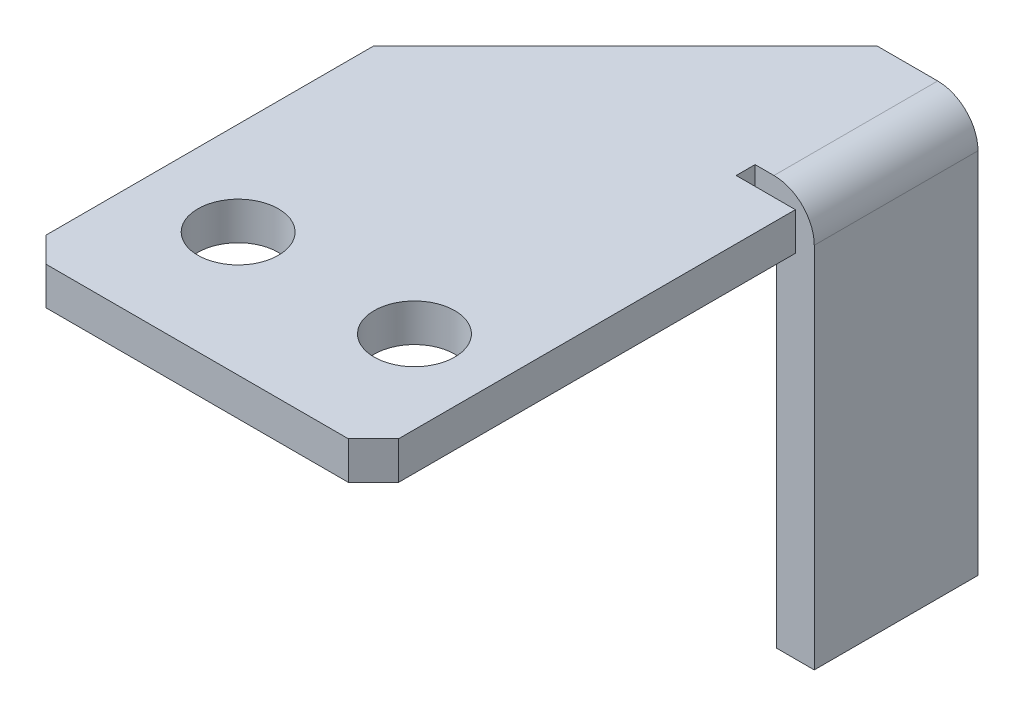
ISO-10303-21;
HEADER;
FILE_DESCRIPTION(('STEP AP214'),'2;1');
FILE_NAME('part.step','',(''),(''),'','','');
FILE_SCHEMA(('AUTOMOTIVE_DESIGN { 1 0 10303 214 1 1 1 1 }'));
ENDSEC;
DATA;
#1=APPLICATION_CONTEXT('core data for automotive mechanical design processes');
#2=APPLICATION_PROTOCOL_DEFINITION('international standard','automotive_design',2000,#1);
#3=PRODUCT_CONTEXT('',#1,'mechanical');
#4=PRODUCT('Part','Part','',(#3));
#5=PRODUCT_RELATED_PRODUCT_CATEGORY('part','',(#4));
#6=PRODUCT_DEFINITION_FORMATION('','',#4);
#7=PRODUCT_DEFINITION_CONTEXT('part definition',#1,'design');
#8=PRODUCT_DEFINITION('design','',#6,#7);
#9=PRODUCT_DEFINITION_SHAPE('','',#8);
#10=(LENGTH_UNIT() NAMED_UNIT(*) SI_UNIT(.MILLI.,.METRE.));
#11=(NAMED_UNIT(*) PLANE_ANGLE_UNIT() SI_UNIT($,.RADIAN.));
#12=(NAMED_UNIT(*) SI_UNIT($,.STERADIAN.) SOLID_ANGLE_UNIT());
#13=UNCERTAINTY_MEASURE_WITH_UNIT(LENGTH_MEASURE(1.E-05),#10,'distance_accuracy_value','');
#14=(GEOMETRIC_REPRESENTATION_CONTEXT(3) GLOBAL_UNCERTAINTY_ASSIGNED_CONTEXT((#13)) GLOBAL_UNIT_ASSIGNED_CONTEXT((#10,
#11,#12)) REPRESENTATION_CONTEXT('',''));
#15=CARTESIAN_POINT('',(0.,0.,0.));
#16=DIRECTION('',(0.,0.,1.));
#17=DIRECTION('',(1.,0.,0.));
#18=AXIS2_PLACEMENT_3D('',#15,#16,#17);
#19=CARTESIAN_POINT('',(5.50210759863531,0.,0.));
#20=DIRECTION('',(-1.,0.,0.));
#21=DIRECTION('',(0.,-1.,0.));
#22=AXIS2_PLACEMENT_3D('',#19,#20,#21);
#23=PLANE('',#22);
#24=DIRECTION('',(0.,1.,0.));
#25=VECTOR('',#24,1.);
#26=CARTESIAN_POINT('',(5.50210759863531,-1.49999999999999,123.920087262032));
#27=LINE('',#26,#25);
#28=CARTESIAN_POINT('',(5.50210759863531,-1.6,123.920087262032));
#29=VERTEX_POINT('',#28);
#30=CARTESIAN_POINT('',(5.50210759863535,-16.1999999999999,123.920087262032));
#31=VERTEX_POINT('',#30);
#32=EDGE_CURVE('E245',#29,#31,#27,.F.);
#33=ORIENTED_EDGE('',*,*,#32,.T.);
#34=DIRECTION('',(0.,0.,1.));
#35=VECTOR('',#34,1.);
#36=CARTESIAN_POINT('',(5.50210759863536,-16.1999999999999,123.920087262032));
#37=LINE('',#36,#35);
#38=CARTESIAN_POINT('',(5.50210759863536,-16.1999999999999,130.420087262032));
#39=VERTEX_POINT('',#38);
#40=EDGE_CURVE('E132',#31,#39,#37,.T.);
#41=ORIENTED_EDGE('',*,*,#40,.T.);
#42=DIRECTION('',(0.,1.,0.));
#43=VECTOR('',#42,1.);
#44=CARTESIAN_POINT('',(5.50210759863536,-16.1999999999999,130.420087262032));
#45=LINE('',#44,#43);
#46=CARTESIAN_POINT('',(5.50210759863534,-1.6,130.420087262032));
#47=VERTEX_POINT('',#46);
#48=EDGE_CURVE('E128',#39,#47,#45,.T.);
#49=ORIENTED_EDGE('',*,*,#48,.T.);
#50=DIRECTION('',(0.,0.,1.));
#51=VECTOR('',#50,1.);
#52=CARTESIAN_POINT('',(5.50210759863531,-1.6,130.420087262032));
#53=LINE('',#52,#51);
#54=EDGE_CURVE('E120',#47,#29,#53,.F.);
#55=ORIENTED_EDGE('',*,*,#54,.T.);
#56=EDGE_LOOP('',(#33,#41,#49,#55));
#57=FACE_BOUND('',#56,.T.);
#58=ADVANCED_FACE('F16',(#57),#23,.T.);
#59=CARTESIAN_POINT('',(7.00210759863536,-16.1999999999999,123.920087262032));
#60=DIRECTION('',(0.,1.,0.));
#61=DIRECTION('',(-1.,0.,0.));
#62=AXIS2_PLACEMENT_3D('',#59,#60,#61);
#63=PLANE('',#62);
#64=DIRECTION('',(-1.,0.,0.));
#65=VECTOR('',#64,1.);
#66=CARTESIAN_POINT('',(7.00210759863536,-16.1999999999999,123.920087262032));
#67=LINE('',#66,#65);
#68=CARTESIAN_POINT('',(7.00210759863536,-16.1999999999999,123.920087262032));
#69=VERTEX_POINT('',#68);
#70=EDGE_CURVE('E243',#69,#31,#67,.T.);
#71=ORIENTED_EDGE('',*,*,#70,.F.);
#72=DIRECTION('',(0.,0.,1.));
#73=VECTOR('',#72,1.);
#74=CARTESIAN_POINT('',(7.00210759863536,-16.1999999999999,0.));
#75=LINE('',#74,#73);
#76=CARTESIAN_POINT('',(7.00210759863536,-16.1999999999999,130.420087262032));
#77=VERTEX_POINT('',#76);
#78=EDGE_CURVE('E143',#69,#77,#75,.T.);
#79=ORIENTED_EDGE('',*,*,#78,.T.);
#80=DIRECTION('',(-1.,0.,0.));
#81=VECTOR('',#80,1.);
#82=CARTESIAN_POINT('',(7.00210759863536,-16.1999999999999,130.420087262032));
#83=LINE('',#82,#81);
#84=EDGE_CURVE('E135',#77,#39,#83,.T.);
#85=ORIENTED_EDGE('',*,*,#84,.T.);
#86=ORIENTED_EDGE('',*,*,#40,.F.);
#87=EDGE_LOOP('',(#71,#79,#85,#86));
#88=FACE_BOUND('',#87,.T.);
#89=ADVANCED_FACE('F338',(#88),#63,.F.);
#90=CARTESIAN_POINT('',(5.40210759863531,-1.6,130.420087262032));
#91=DIRECTION('',(0.,0.,1.));
#92=DIRECTION('',(1.,0.,0.));
#93=AXIS2_PLACEMENT_3D('',#90,#91,#92);
#94=CYLINDRICAL_SURFACE('',#93,0.1);
#95=CARTESIAN_POINT('',(5.40210759863531,-1.6,123.920087262032));
#96=DIRECTION('',(0.,0.,1.));
#97=DIRECTION('',(1.,0.,0.));
#98=AXIS2_PLACEMENT_3D('',#95,#96,#97);
#99=CIRCLE('',#98,0.1);
#100=CARTESIAN_POINT('',(5.40210759863531,-1.5,123.920087262032));
#101=VERTEX_POINT('',#100);
#102=EDGE_CURVE('E126',#29,#101,#99,.T.);
#103=ORIENTED_EDGE('',*,*,#102,.F.);
#104=ORIENTED_EDGE('',*,*,#54,.F.);
#105=CARTESIAN_POINT('',(5.40210759863531,-1.6,130.420087262032));
#106=DIRECTION('',(0.,0.,1.));
#107=DIRECTION('',(1.,0.,0.));
#108=AXIS2_PLACEMENT_3D('',#105,#106,#107);
#109=CIRCLE('',#108,0.1);
#110=CARTESIAN_POINT('',(5.40210759863531,-1.5,130.420087262032));
#111=VERTEX_POINT('',#110);
#112=EDGE_CURVE('E19',#47,#111,#109,.T.);
#113=ORIENTED_EDGE('',*,*,#112,.T.);
#114=DIRECTION('',(0.,0.,-1.));
#115=VECTOR('',#114,1.);
#116=CARTESIAN_POINT('',(5.40210759863531,-1.5,0.));
#117=LINE('',#116,#115);
#118=EDGE_CURVE('E167',#101,#111,#117,.F.);
#119=ORIENTED_EDGE('',*,*,#118,.F.);
#120=EDGE_LOOP('',(#103,#104,#113,#119));
#121=FACE_BOUND('',#120,.T.);
#122=ADVANCED_FACE('F122',(#121),#94,.F.);
#123=CARTESIAN_POINT('',(7.00210759863531,0.,0.));
#124=DIRECTION('',(-1.,0.,0.));
#125=DIRECTION('',(0.,-1.,0.));
#126=AXIS2_PLACEMENT_3D('',#123,#124,#125);
#127=PLANE('',#126);
#128=DIRECTION('',(0.,-1.,0.));
#129=VECTOR('',#128,1.);
#130=CARTESIAN_POINT('',(7.00210759863531,0.,130.420087262032));
#131=LINE('',#130,#129);
#132=CARTESIAN_POINT('',(7.00210759863531,-1.6,130.420087262032));
#133=VERTEX_POINT('',#132);
#134=EDGE_CURVE('E149',#77,#133,#131,.F.);
#135=ORIENTED_EDGE('',*,*,#134,.F.);
#136=ORIENTED_EDGE('',*,*,#78,.F.);
#137=DIRECTION('',(0.,-1.,0.));
#138=VECTOR('',#137,1.);
#139=CARTESIAN_POINT('',(7.00210759863531,0.,123.920087262032));
#140=LINE('',#139,#138);
#141=CARTESIAN_POINT('',(7.00210759863531,-1.6,123.920087262032));
#142=VERTEX_POINT('',#141);
#143=EDGE_CURVE('E141',#142,#69,#140,.T.);
#144=ORIENTED_EDGE('',*,*,#143,.F.);
#145=DIRECTION('',(0.,0.,1.));
#146=VECTOR('',#145,1.);
#147=CARTESIAN_POINT('',(7.00210759863531,-1.6,130.420087262032));
#148=LINE('',#147,#146);
#149=EDGE_CURVE('E262',#133,#142,#148,.F.);
#150=ORIENTED_EDGE('',*,*,#149,.F.);
#151=EDGE_LOOP('',(#135,#136,#144,#150));
#152=FACE_BOUND('',#151,.T.);
#153=ADVANCED_FACE('F335',(#152),#127,.F.);
#154=CARTESIAN_POINT('',(4.65210759863531,-1.5,130.420087262032));
#155=DIRECTION('',(0.,0.,1.));
#156=DIRECTION('',(0.,-1.,0.));
#157=AXIS2_PLACEMENT_3D('',#154,#155,#156);
#158=PLANE('',#157);
#159=DIRECTION('',(0.,1.,0.));
#160=VECTOR('',#159,1.);
#161=CARTESIAN_POINT('',(4.65210759863531,-1.5,130.420087262032));
#162=LINE('',#161,#160);
#163=CARTESIAN_POINT('',(4.65210759863531,-1.5,130.420087262032));
#164=VERTEX_POINT('',#163);
#165=CARTESIAN_POINT('',(4.65210759863531,0.,130.420087262032));
#166=VERTEX_POINT('',#165);
#167=EDGE_CURVE('E224',#164,#166,#162,.T.);
#168=ORIENTED_EDGE('',*,*,#167,.F.);
#169=DIRECTION('',(1.,0.,0.));
#170=VECTOR('',#169,1.);
#171=CARTESIAN_POINT('',(0.,-1.5,130.420087262032));
#172=LINE('',#171,#170);
#173=EDGE_CURVE('E140',#111,#164,#172,.F.);
#174=ORIENTED_EDGE('',*,*,#173,.F.);
#175=ORIENTED_EDGE('',*,*,#112,.F.);
#176=ORIENTED_EDGE('',*,*,#48,.F.);
#177=ORIENTED_EDGE('',*,*,#84,.F.);
#178=ORIENTED_EDGE('',*,*,#134,.T.);
#179=CARTESIAN_POINT('',(5.40210759863531,-1.6,130.420087262032));
#180=DIRECTION('',(0.,0.,1.));
#181=DIRECTION('',(1.,0.,0.));
#182=AXIS2_PLACEMENT_3D('',#179,#180,#181);
#183=CIRCLE('',#182,1.6);
#184=CARTESIAN_POINT('',(5.40210759863531,0.,130.420087262032));
#185=VERTEX_POINT('',#184);
#186=EDGE_CURVE('E176',#185,#133,#183,.F.);
#187=ORIENTED_EDGE('',*,*,#186,.F.);
#188=DIRECTION('',(1.,0.,0.));
#189=VECTOR('',#188,1.);
#190=CARTESIAN_POINT('',(4.65210759863531,0.,130.420087262032));
#191=LINE('',#190,#189);
#192=EDGE_CURVE('E169',#185,#166,#191,.F.);
#193=ORIENTED_EDGE('',*,*,#192,.T.);
#194=EDGE_LOOP('',(#168,#174,#175,#176,#177,#178,#187,#193));
#195=FACE_BOUND('',#194,.T.);
#196=ADVANCED_FACE('F139',(#195),#158,.T.);
#197=CARTESIAN_POINT('',(0.,-1.5,0.));
#198=DIRECTION('',(0.,-1.,0.));
#199=DIRECTION('',(0.,0.,-1.));
#200=AXIS2_PLACEMENT_3D('',#197,#198,#199);
#201=PLANE('',#200);
#202=DIRECTION('',(0.,0.,-1.));
#203=VECTOR('',#202,1.);
#204=CARTESIAN_POINT('',(4.65210759863531,-1.5,131.170087262032));
#205=LINE('',#204,#203);
#206=CARTESIAN_POINT('',(4.65210759863531,-1.5,131.170087262032));
#207=VERTEX_POINT('',#206);
#208=EDGE_CURVE('E227',#207,#164,#205,.T.);
#209=ORIENTED_EDGE('',*,*,#208,.F.);
#210=DIRECTION('',(1.,0.,0.));
#211=VECTOR('',#210,1.);
#212=CARTESIAN_POINT('',(7.00210759863531,-1.5,131.170087262032));
#213=LINE('',#212,#211);
#214=CARTESIAN_POINT('',(7.00210759863531,-1.5,131.170087262032));
#215=VERTEX_POINT('',#214);
#216=EDGE_CURVE('E295',#215,#207,#213,.F.);
#217=ORIENTED_EDGE('',*,*,#216,.F.);
#218=DIRECTION('',(0.,0.,-1.));
#219=VECTOR('',#218,1.);
#220=CARTESIAN_POINT('',(7.00210759863531,-1.5,147.920087262032));
#221=LINE('',#220,#219);
#222=CARTESIAN_POINT('',(7.00210759863531,-1.5,146.920087262032));
#223=VERTEX_POINT('',#222);
#224=EDGE_CURVE('E298',#223,#215,#221,.T.);
#225=ORIENTED_EDGE('',*,*,#224,.F.);
#226=DIRECTION('',(-0.707106781186545,0.,0.70710678118655));
#227=VECTOR('',#226,1.);
#228=CARTESIAN_POINT('',(6.00210759863532,-1.5,147.920087262032));
#229=LINE('',#228,#227);
#230=CARTESIAN_POINT('',(6.00210759863532,-1.5,147.920087262032));
#231=VERTEX_POINT('',#230);
#232=EDGE_CURVE('E216',#223,#231,#229,.T.);
#233=ORIENTED_EDGE('',*,*,#232,.T.);
#234=DIRECTION('',(1.,0.,0.));
#235=VECTOR('',#234,1.);
#236=CARTESIAN_POINT('',(-6.99789240136469,-1.5,147.920087262032));
#237=LINE('',#236,#235);
#238=CARTESIAN_POINT('',(-5.99789240136469,-1.5,147.920087262032));
#239=VERTEX_POINT('',#238);
#240=EDGE_CURVE('E214',#239,#231,#237,.T.);
#241=ORIENTED_EDGE('',*,*,#240,.F.);
#242=DIRECTION('',(-0.707106781186548,0.,-0.707106781186548));
#243=VECTOR('',#242,1.);
#244=CARTESIAN_POINT('',(-6.99789240136469,-1.5,146.920087262032));
#245=LINE('',#244,#243);
#246=CARTESIAN_POINT('',(-6.99789240136469,-1.5,146.920087262032));
#247=VERTEX_POINT('',#246);
#248=EDGE_CURVE('E186',#239,#247,#245,.T.);
#249=ORIENTED_EDGE('',*,*,#248,.T.);
#250=DIRECTION('',(0.,0.,1.));
#251=VECTOR('',#250,1.);
#252=CARTESIAN_POINT('',(-6.99789240136469,-1.5,147.920087262032));
#253=LINE('',#252,#251);
#254=CARTESIAN_POINT('',(-6.99789240136469,-1.5,133.920087262032));
#255=VERTEX_POINT('',#254);
#256=EDGE_CURVE('E184',#255,#247,#253,.T.);
#257=ORIENTED_EDGE('',*,*,#256,.F.);
#258=DIRECTION('',(0.707106781186547,0.,-0.707106781186549));
#259=VECTOR('',#258,1.);
#260=CARTESIAN_POINT('',(3.00210759863532,-1.5,123.920087262032));
#261=LINE('',#260,#259);
#262=CARTESIAN_POINT('',(3.00210759863532,-1.5,123.920087262032));
#263=VERTEX_POINT('',#262);
#264=EDGE_CURVE('E164',#255,#263,#261,.T.);
#265=ORIENTED_EDGE('',*,*,#264,.T.);
#266=DIRECTION('',(-1.,0.,0.));
#267=VECTOR('',#266,1.);
#268=CARTESIAN_POINT('',(-6.99789240136469,-1.5,123.920087262032));
#269=LINE('',#268,#267);
#270=EDGE_CURVE('E161',#101,#263,#269,.T.);
#271=ORIENTED_EDGE('',*,*,#270,.F.);
#272=ORIENTED_EDGE('',*,*,#118,.T.);
#273=ORIENTED_EDGE('',*,*,#173,.T.);
#274=EDGE_LOOP('',(#209,#217,#225,#233,#241,#249,#257,#265,#271,#272,#273));
#275=FACE_BOUND('',#274,.T.);
#276=CARTESIAN_POINT('',(-3.28963196322974,-1.5,143.000438712782));
#277=DIRECTION('',(0.,-1.,0.));
#278=DIRECTION('',(0.,0.,-1.));
#279=AXIS2_PLACEMENT_3D('',#276,#277,#278);
#280=CIRCLE('',#279,1.59999999999999);
#281=CARTESIAN_POINT('',(-3.28963196322974,-1.5,141.400438712782));
#282=VERTEX_POINT('',#281);
#283=EDGE_CURVE('E220',#282,#282,#280,.F.);
#284=ORIENTED_EDGE('',*,*,#283,.T.);
#285=EDGE_LOOP('',(#284));
#286=FACE_BOUND('',#285,.T.);
#287=CARTESIAN_POINT('',(3.71036803677027,-1.5,143.000438712782));
#288=DIRECTION('',(0.,-1.,0.));
#289=DIRECTION('',(0.,0.,-1.));
#290=AXIS2_PLACEMENT_3D('',#287,#288,#289);
#291=CIRCLE('',#290,1.59999999999999);
#292=CARTESIAN_POINT('',(3.71036803677027,-1.5,141.400438712782));
#293=VERTEX_POINT('',#292);
#294=EDGE_CURVE('E202',#293,#293,#291,.F.);
#295=ORIENTED_EDGE('',*,*,#294,.T.);
#296=EDGE_LOOP('',(#295));
#297=FACE_BOUND('',#296,.T.);
#298=ADVANCED_FACE('F271',(#275,#286,#297),#201,.T.);
#299=CARTESIAN_POINT('',(-3.28963196322974,0.,143.000438712782));
#300=DIRECTION('',(0.,-1.,0.));
#301=DIRECTION('',(0.,0.,-1.));
#302=AXIS2_PLACEMENT_3D('',#299,#300,#301);
#303=CYLINDRICAL_SURFACE('',#302,1.59999999999999);
#304=ORIENTED_EDGE('',*,*,#283,.F.);
#305=EDGE_LOOP('',(#304));
#306=FACE_BOUND('',#305,.T.);
#307=CARTESIAN_POINT('',(-3.28963196322974,0.,143.000438712782));
#308=DIRECTION('',(0.,-1.,0.));
#309=DIRECTION('',(0.,0.,-1.));
#310=AXIS2_PLACEMENT_3D('',#307,#308,#309);
#311=CIRCLE('',#310,1.59999999999999);
#312=CARTESIAN_POINT('',(-3.28963196322974,0.,141.400438712782));
#313=VERTEX_POINT('',#312);
#314=EDGE_CURVE('E211',#313,#313,#311,.F.);
#315=ORIENTED_EDGE('',*,*,#314,.T.);
#316=EDGE_LOOP('',(#315));
#317=FACE_BOUND('',#316,.T.);
#318=ADVANCED_FACE('F380',(#306,#317),#303,.F.);
#319=CARTESIAN_POINT('',(3.71036803677027,0.,143.000438712782));
#320=DIRECTION('',(0.,-1.,0.));
#321=DIRECTION('',(0.,0.,-1.));
#322=AXIS2_PLACEMENT_3D('',#319,#320,#321);
#323=CYLINDRICAL_SURFACE('',#322,1.59999999999999);
#324=ORIENTED_EDGE('',*,*,#294,.F.);
#325=EDGE_LOOP('',(#324));
#326=FACE_BOUND('',#325,.T.);
#327=CARTESIAN_POINT('',(3.71036803677027,0.,143.000438712782));
#328=DIRECTION('',(0.,-1.,0.));
#329=DIRECTION('',(0.,0.,-1.));
#330=AXIS2_PLACEMENT_3D('',#327,#328,#329);
#331=CIRCLE('',#330,1.59999999999999);
#332=CARTESIAN_POINT('',(3.71036803677027,0.,141.400438712782));
#333=VERTEX_POINT('',#332);
#334=EDGE_CURVE('E256',#333,#333,#331,.F.);
#335=ORIENTED_EDGE('',*,*,#334,.T.);
#336=EDGE_LOOP('',(#335));
#337=FACE_BOUND('',#336,.T.);
#338=ADVANCED_FACE('F376',(#326,#337),#323,.F.);
#339=CARTESIAN_POINT('',(-6.99789240136469,0.,146.920087262032));
#340=DIRECTION('',(0.707106781186548,0.,-0.707106781186548));
#341=DIRECTION('',(-0.707106781186548,0.,-0.707106781186548));
#342=AXIS2_PLACEMENT_3D('',#339,#340,#341);
#343=PLANE('',#342);
#344=DIRECTION('',(0.,1.,0.));
#345=VECTOR('',#344,1.);
#346=CARTESIAN_POINT('',(-5.99789240136469,0.,147.920087262032));
#347=LINE('',#346,#345);
#348=CARTESIAN_POINT('',(-5.99789240136469,0.,147.920087262032));
#349=VERTEX_POINT('',#348);
#350=EDGE_CURVE('E208',#349,#239,#347,.F.);
#351=ORIENTED_EDGE('',*,*,#350,.F.);
#352=DIRECTION('',(-0.707106781186547,0.,-0.707106781186547));
#353=VECTOR('',#352,1.);
#354=CARTESIAN_POINT('',(-5.99789240136469,0.,147.920087262032));
#355=LINE('',#354,#353);
#356=CARTESIAN_POINT('',(-6.99789240136469,0.,146.920087262032));
#357=VERTEX_POINT('',#356);
#358=EDGE_CURVE('E197',#349,#357,#355,.T.);
#359=ORIENTED_EDGE('',*,*,#358,.T.);
#360=DIRECTION('',(0.,1.,0.));
#361=VECTOR('',#360,1.);
#362=CARTESIAN_POINT('',(-6.99789240136469,0.,146.920087262032));
#363=LINE('',#362,#361);
#364=EDGE_CURVE('E181',#247,#357,#363,.T.);
#365=ORIENTED_EDGE('',*,*,#364,.F.);
#366=ORIENTED_EDGE('',*,*,#248,.F.);
#367=EDGE_LOOP('',(#351,#359,#365,#366));
#368=FACE_BOUND('',#367,.T.);
#369=ADVANCED_FACE('F372',(#368),#343,.F.);
#370=CARTESIAN_POINT('',(-6.99789240136469,0.,147.920087262032));
#371=DIRECTION('',(-1.,0.,0.));
#372=DIRECTION('',(0.,0.,1.));
#373=AXIS2_PLACEMENT_3D('',#370,#371,#372);
#374=PLANE('',#373);
#375=DIRECTION('',(0.,0.,-1.));
#376=VECTOR('',#375,1.);
#377=CARTESIAN_POINT('',(-6.99789240136469,0.,0.));
#378=LINE('',#377,#376);
#379=CARTESIAN_POINT('',(-6.99789240136469,0.,133.920087262032));
#380=VERTEX_POINT('',#379);
#381=EDGE_CURVE('E192',#357,#380,#378,.T.);
#382=ORIENTED_EDGE('',*,*,#381,.T.);
#383=DIRECTION('',(0.,1.,0.));
#384=VECTOR('',#383,1.);
#385=CARTESIAN_POINT('',(-6.99789240136469,0.,133.920087262032));
#386=LINE('',#385,#384);
#387=EDGE_CURVE('E172',#380,#255,#386,.F.);
#388=ORIENTED_EDGE('',*,*,#387,.T.);
#389=ORIENTED_EDGE('',*,*,#256,.T.);
#390=ORIENTED_EDGE('',*,*,#364,.T.);
#391=EDGE_LOOP('',(#382,#388,#389,#390));
#392=FACE_BOUND('',#391,.T.);
#393=ADVANCED_FACE('F369',(#392),#374,.T.);
#394=CARTESIAN_POINT('',(3.00210759863532,0.,123.920087262032));
#395=DIRECTION('',(0.707106781186549,0.,0.707106781186547));
#396=DIRECTION('',(0.707106781186547,0.,-0.707106781186549));
#397=AXIS2_PLACEMENT_3D('',#394,#395,#396);
#398=PLANE('',#397);
#399=ORIENTED_EDGE('',*,*,#387,.F.);
#400=DIRECTION('',(0.707106781186547,0.,-0.707106781186549));
#401=VECTOR('',#400,1.);
#402=CARTESIAN_POINT('',(-6.99789240136469,0.,133.920087262032));
#403=LINE('',#402,#401);
#404=CARTESIAN_POINT('',(3.00210759863532,0.,123.920087262032));
#405=VERTEX_POINT('',#404);
#406=EDGE_CURVE('E189',#380,#405,#403,.T.);
#407=ORIENTED_EDGE('',*,*,#406,.T.);
#408=DIRECTION('',(0.,1.,0.));
#409=VECTOR('',#408,1.);
#410=CARTESIAN_POINT('',(3.00210759863532,0.,123.920087262032));
#411=LINE('',#410,#409);
#412=EDGE_CURVE('E163',#263,#405,#411,.T.);
#413=ORIENTED_EDGE('',*,*,#412,.F.);
#414=ORIENTED_EDGE('',*,*,#264,.F.);
#415=EDGE_LOOP('',(#399,#407,#413,#414));
#416=FACE_BOUND('',#415,.T.);
#417=ADVANCED_FACE('F276',(#416),#398,.F.);
#418=CARTESIAN_POINT('',(-6.99789240136469,0.,123.920087262032));
#419=DIRECTION('',(0.,0.,-1.));
#420=DIRECTION('',(-1.,0.,0.));
#421=AXIS2_PLACEMENT_3D('',#418,#419,#420);
#422=PLANE('',#421);
#423=DIRECTION('',(1.,0.,0.));
#424=VECTOR('',#423,1.);
#425=CARTESIAN_POINT('',(0.,0.,123.920087262032));
#426=LINE('',#425,#424);
#427=CARTESIAN_POINT('',(5.40210759863531,0.,123.920087262032));
#428=VERTEX_POINT('',#427);
#429=EDGE_CURVE('E153',#405,#428,#426,.T.);
#430=ORIENTED_EDGE('',*,*,#429,.T.);
#431=CARTESIAN_POINT('',(5.40210759863531,-1.6,123.920087262032));
#432=DIRECTION('',(0.,0.,1.));
#433=DIRECTION('',(1.,0.,0.));
#434=AXIS2_PLACEMENT_3D('',#431,#432,#433);
#435=CIRCLE('',#434,1.6);
#436=EDGE_CURVE('E228',#142,#428,#435,.T.);
#437=ORIENTED_EDGE('',*,*,#436,.F.);
#438=ORIENTED_EDGE('',*,*,#143,.T.);
#439=ORIENTED_EDGE('',*,*,#70,.T.);
#440=ORIENTED_EDGE('',*,*,#32,.F.);
#441=ORIENTED_EDGE('',*,*,#102,.T.);
#442=ORIENTED_EDGE('',*,*,#270,.T.);
#443=ORIENTED_EDGE('',*,*,#412,.T.);
#444=EDGE_LOOP('',(#430,#437,#438,#439,#440,#441,#442,#443));
#445=FACE_BOUND('',#444,.T.);
#446=ADVANCED_FACE('F268',(#445),#422,.T.);
#447=CARTESIAN_POINT('',(5.40210759863531,-1.6,130.420087262032));
#448=DIRECTION('',(0.,0.,1.));
#449=DIRECTION('',(1.,0.,0.));
#450=AXIS2_PLACEMENT_3D('',#447,#448,#449);
#451=CYLINDRICAL_SURFACE('',#450,1.6);
#452=ORIENTED_EDGE('',*,*,#149,.T.);
#453=ORIENTED_EDGE('',*,*,#436,.T.);
#454=DIRECTION('',(0.,0.,-1.));
#455=VECTOR('',#454,1.);
#456=CARTESIAN_POINT('',(5.40210759863531,0.,0.));
#457=LINE('',#456,#455);
#458=EDGE_CURVE('E235',#428,#185,#457,.F.);
#459=ORIENTED_EDGE('',*,*,#458,.T.);
#460=ORIENTED_EDGE('',*,*,#186,.T.);
#461=EDGE_LOOP('',(#452,#453,#459,#460));
#462=FACE_BOUND('',#461,.T.);
#463=ADVANCED_FACE('F333',(#462),#451,.T.);
#464=CARTESIAN_POINT('',(4.65210759863531,-1.5,131.170087262032));
#465=DIRECTION('',(1.,0.,0.));
#466=DIRECTION('',(0.,0.,-1.));
#467=AXIS2_PLACEMENT_3D('',#464,#465,#466);
#468=PLANE('',#467);
#469=DIRECTION('',(0.,1.,0.));
#470=VECTOR('',#469,1.);
#471=CARTESIAN_POINT('',(4.65210759863531,-1.5,131.170087262032));
#472=LINE('',#471,#470);
#473=CARTESIAN_POINT('',(4.65210759863531,0.,131.170087262032));
#474=VERTEX_POINT('',#473);
#475=EDGE_CURVE('E293',#207,#474,#472,.T.);
#476=ORIENTED_EDGE('',*,*,#475,.F.);
#477=ORIENTED_EDGE('',*,*,#208,.T.);
#478=ORIENTED_EDGE('',*,*,#167,.T.);
#479=DIRECTION('',(0.,0.,-1.));
#480=VECTOR('',#479,1.);
#481=CARTESIAN_POINT('',(4.65210759863531,0.,0.));
#482=LINE('',#481,#480);
#483=EDGE_CURVE('E231',#166,#474,#482,.F.);
#484=ORIENTED_EDGE('',*,*,#483,.T.);
#485=EDGE_LOOP('',(#476,#477,#478,#484));
#486=FACE_BOUND('',#485,.T.);
#487=ADVANCED_FACE('F330',(#486),#468,.T.);
#488=CARTESIAN_POINT('',(7.00210759863531,-1.5,131.170087262032));
#489=DIRECTION('',(0.,0.,-1.));
#490=DIRECTION('',(0.,1.,0.));
#491=AXIS2_PLACEMENT_3D('',#488,#489,#490);
#492=PLANE('',#491);
#493=DIRECTION('',(0.,1.,0.));
#494=VECTOR('',#493,1.);
#495=CARTESIAN_POINT('',(7.00210759863531,0.,131.170087262032));
#496=LINE('',#495,#494);
#497=CARTESIAN_POINT('',(7.00210759863531,0.,131.170087262032));
#498=VERTEX_POINT('',#497);
#499=EDGE_CURVE('E300',#215,#498,#496,.T.);
#500=ORIENTED_EDGE('',*,*,#499,.F.);
#501=ORIENTED_EDGE('',*,*,#216,.T.);
#502=ORIENTED_EDGE('',*,*,#475,.T.);
#503=DIRECTION('',(1.,0.,0.));
#504=VECTOR('',#503,1.);
#505=CARTESIAN_POINT('',(0.,0.,131.170087262032));
#506=LINE('',#505,#504);
#507=EDGE_CURVE('E234',#474,#498,#506,.T.);
#508=ORIENTED_EDGE('',*,*,#507,.T.);
#509=EDGE_LOOP('',(#500,#501,#502,#508));
#510=FACE_BOUND('',#509,.T.);
#511=ADVANCED_FACE('F326',(#510),#492,.T.);
#512=CARTESIAN_POINT('',(7.00210759863531,0.,147.920087262032));
#513=DIRECTION('',(1.,0.,0.));
#514=DIRECTION('',(0.,0.,-1.));
#515=AXIS2_PLACEMENT_3D('',#512,#513,#514);
#516=PLANE('',#515);
#517=ORIENTED_EDGE('',*,*,#224,.T.);
#518=ORIENTED_EDGE('',*,*,#499,.T.);
#519=DIRECTION('',(0.,0.,-1.));
#520=VECTOR('',#519,1.);
#521=CARTESIAN_POINT('',(7.00210759863531,0.,0.));
#522=LINE('',#521,#520);
#523=CARTESIAN_POINT('',(7.00210759863531,0.,146.920087262032));
#524=VERTEX_POINT('',#523);
#525=EDGE_CURVE('E312',#498,#524,#522,.F.);
#526=ORIENTED_EDGE('',*,*,#525,.T.);
#527=DIRECTION('',(0.,1.,0.));
#528=VECTOR('',#527,1.);
#529=CARTESIAN_POINT('',(7.00210759863531,0.,146.920087262032));
#530=LINE('',#529,#528);
#531=EDGE_CURVE('E302',#524,#223,#530,.F.);
#532=ORIENTED_EDGE('',*,*,#531,.T.);
#533=EDGE_LOOP('',(#517,#518,#526,#532));
#534=FACE_BOUND('',#533,.T.);
#535=ADVANCED_FACE('F322',(#534),#516,.T.);
#536=CARTESIAN_POINT('',(6.00210759863532,0.,147.920087262032));
#537=DIRECTION('',(-0.70710678118655,0.,-0.707106781186545));
#538=DIRECTION('',(-0.707106781186545,0.,0.70710678118655));
#539=AXIS2_PLACEMENT_3D('',#536,#537,#538);
#540=PLANE('',#539);
#541=ORIENTED_EDGE('',*,*,#531,.F.);
#542=DIRECTION('',(-0.707106781186545,0.,0.70710678118655));
#543=VECTOR('',#542,1.);
#544=CARTESIAN_POINT('',(7.00210759863531,0.,146.920087262032));
#545=LINE('',#544,#543);
#546=CARTESIAN_POINT('',(6.00210759863532,0.,147.920087262032));
#547=VERTEX_POINT('',#546);
#548=EDGE_CURVE('E25',#524,#547,#545,.T.);
#549=ORIENTED_EDGE('',*,*,#548,.T.);
#550=DIRECTION('',(0.,1.,0.));
#551=VECTOR('',#550,1.);
#552=CARTESIAN_POINT('',(6.00210759863532,0.,147.920087262032));
#553=LINE('',#552,#551);
#554=EDGE_CURVE('E33',#231,#547,#553,.T.);
#555=ORIENTED_EDGE('',*,*,#554,.F.);
#556=ORIENTED_EDGE('',*,*,#232,.F.);
#557=EDGE_LOOP('',(#541,#549,#555,#556));
#558=FACE_BOUND('',#557,.T.);
#559=ADVANCED_FACE('F317',(#558),#540,.F.);
#560=CARTESIAN_POINT('',(-6.99789240136469,0.,147.920087262032));
#561=DIRECTION('',(0.,0.,1.));
#562=DIRECTION('',(1.,0.,0.));
#563=AXIS2_PLACEMENT_3D('',#560,#561,#562);
#564=PLANE('',#563);
#565=DIRECTION('',(1.,0.,0.));
#566=VECTOR('',#565,1.);
#567=CARTESIAN_POINT('',(0.,0.,147.920087262032));
#568=LINE('',#567,#566);
#569=EDGE_CURVE('E11',#547,#349,#568,.F.);
#570=ORIENTED_EDGE('',*,*,#569,.T.);
#571=ORIENTED_EDGE('',*,*,#350,.T.);
#572=ORIENTED_EDGE('',*,*,#240,.T.);
#573=ORIENTED_EDGE('',*,*,#554,.T.);
#574=EDGE_LOOP('',(#570,#571,#572,#573));
#575=FACE_BOUND('',#574,.T.);
#576=ADVANCED_FACE('F348',(#575),#564,.T.);
#577=CARTESIAN_POINT('',(0.,0.,0.));
#578=DIRECTION('',(0.,-1.,0.));
#579=DIRECTION('',(0.,0.,-1.));
#580=AXIS2_PLACEMENT_3D('',#577,#578,#579);
#581=PLANE('',#580);
#582=ORIENTED_EDGE('',*,*,#548,.F.);
#583=ORIENTED_EDGE('',*,*,#525,.F.);
#584=ORIENTED_EDGE('',*,*,#507,.F.);
#585=ORIENTED_EDGE('',*,*,#483,.F.);
#586=ORIENTED_EDGE('',*,*,#192,.F.);
#587=ORIENTED_EDGE('',*,*,#458,.F.);
#588=ORIENTED_EDGE('',*,*,#429,.F.);
#589=ORIENTED_EDGE('',*,*,#406,.F.);
#590=ORIENTED_EDGE('',*,*,#381,.F.);
#591=ORIENTED_EDGE('',*,*,#358,.F.);
#592=ORIENTED_EDGE('',*,*,#569,.F.);
#593=EDGE_LOOP('',(#582,#583,#584,#585,#586,#587,#588,#589,#590,#591,#592));
#594=FACE_BOUND('',#593,.T.);
#595=ORIENTED_EDGE('',*,*,#334,.F.);
#596=EDGE_LOOP('',(#595));
#597=FACE_BOUND('',#596,.T.);
#598=ORIENTED_EDGE('',*,*,#314,.F.);
#599=EDGE_LOOP('',(#598));
#600=FACE_BOUND('',#599,.T.);
#601=ADVANCED_FACE('F282',(#594,#597,#600),#581,.F.);
#602=CLOSED_SHELL('',(#58,#89,#122,#153,#196,#298,#318,#338,#369,#393,#417,#446,#463,#487,#511,
#535,#559,#576,#601));
#603=MANIFOLD_SOLID_BREP('B1',#602);
#604=ADVANCED_BREP_SHAPE_REPRESENTATION('',(#18,#603),#14);
#605=SHAPE_DEFINITION_REPRESENTATION(#9,#604);
ENDSEC;
END-ISO-10303-21;
